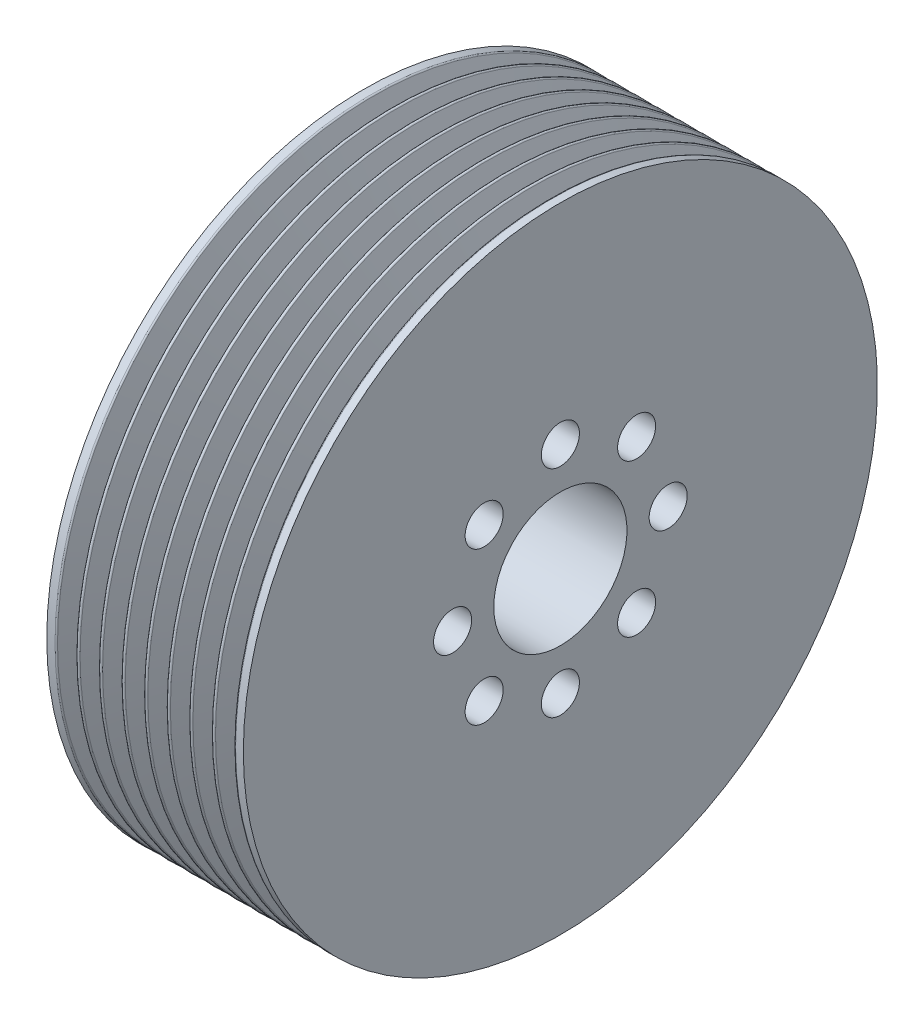
ISO-10303-21;
HEADER;
FILE_DESCRIPTION(('STEP AP214'),'2;1');
FILE_NAME('part.step','',(''),(''),'','','');
FILE_SCHEMA(('AUTOMOTIVE_DESIGN { 1 0 10303 214 1 1 1 1 }'));
ENDSEC;
DATA;
#1=APPLICATION_CONTEXT('core data for automotive mechanical design processes');
#2=APPLICATION_PROTOCOL_DEFINITION('international standard','automotive_design',2000,#1);
#3=PRODUCT_CONTEXT('',#1,'mechanical');
#4=PRODUCT('Part','Part','',(#3));
#5=PRODUCT_RELATED_PRODUCT_CATEGORY('part','',(#4));
#6=PRODUCT_DEFINITION_FORMATION('','',#4);
#7=PRODUCT_DEFINITION_CONTEXT('part definition',#1,'design');
#8=PRODUCT_DEFINITION('design','',#6,#7);
#9=PRODUCT_DEFINITION_SHAPE('','',#8);
#10=(LENGTH_UNIT() NAMED_UNIT(*) SI_UNIT(.MILLI.,.METRE.));
#11=(NAMED_UNIT(*) PLANE_ANGLE_UNIT() SI_UNIT($,.RADIAN.));
#12=(NAMED_UNIT(*) SI_UNIT($,.STERADIAN.) SOLID_ANGLE_UNIT());
#13=UNCERTAINTY_MEASURE_WITH_UNIT(LENGTH_MEASURE(1.E-05),#10,'distance_accuracy_value','');
#14=(GEOMETRIC_REPRESENTATION_CONTEXT(3) GLOBAL_UNCERTAINTY_ASSIGNED_CONTEXT((#13)) GLOBAL_UNIT_ASSIGNED_CONTEXT((#10,
#11,#12)) REPRESENTATION_CONTEXT('',''));
#15=CARTESIAN_POINT('',(0.,0.,0.));
#16=DIRECTION('',(0.,0.,1.));
#17=DIRECTION('',(1.,0.,0.));
#18=AXIS2_PLACEMENT_3D('',#15,#16,#17);
#19=CARTESIAN_POINT('',(0.,0.,0.));
#20=DIRECTION('',(-1.,0.,0.));
#21=DIRECTION('',(0.,0.,1.));
#22=AXIS2_PLACEMENT_3D('',#19,#20,#21);
#23=CYLINDRICAL_SURFACE('',#22,50.);
#24=CARTESIAN_POINT('',(18.,0.,0.));
#25=DIRECTION('',(-1.,0.,0.));
#26=DIRECTION('',(0.,0.,1.));
#27=AXIS2_PLACEMENT_3D('',#24,#25,#26);
#28=CIRCLE('',#27,50.);
#29=CARTESIAN_POINT('',(18.,0.,50.));
#30=VERTEX_POINT('',#29);
#31=EDGE_CURVE('E59',#30,#30,#28,.T.);
#32=ORIENTED_EDGE('',*,*,#31,.F.);
#33=EDGE_LOOP('',(#32));
#34=FACE_BOUND('',#33,.T.);
#35=CARTESIAN_POINT('',(19.3,0.,0.));
#36=DIRECTION('',(-1.,0.,0.));
#37=DIRECTION('',(0.,0.,1.));
#38=AXIS2_PLACEMENT_3D('',#35,#36,#37);
#39=CIRCLE('',#38,50.);
#40=CARTESIAN_POINT('',(19.3,0.,50.));
#41=VERTEX_POINT('',#40);
#42=EDGE_CURVE('E210',#41,#41,#39,.T.);
#43=ORIENTED_EDGE('',*,*,#42,.T.);
#44=EDGE_LOOP('',(#43));
#45=FACE_BOUND('',#44,.T.);
#46=ADVANCED_FACE('F45',(#34,#45),#23,.T.);
#47=CARTESIAN_POINT('',(31.5,10.5,0.));
#48=DIRECTION('',(1.,0.,0.));
#49=DIRECTION('',(0.,0.,-1.));
#50=AXIS2_PLACEMENT_3D('',#47,#48,#49);
#51=PLANE('',#50);
#52=CARTESIAN_POINT('',(31.5,12.0208152801713,12.0208152801713));
#53=DIRECTION('',(1.,0.,0.));
#54=DIRECTION('',(0.,0.,-1.));
#55=AXIS2_PLACEMENT_3D('',#52,#53,#54);
#56=CIRCLE('',#55,3.);
#57=CARTESIAN_POINT('',(31.5,12.0208152801713,9.02081528017131));
#58=VERTEX_POINT('',#57);
#59=EDGE_CURVE('E270',#58,#58,#56,.F.);
#60=ORIENTED_EDGE('',*,*,#59,.F.);
#61=EDGE_LOOP('',(#60));
#62=FACE_BOUND('',#61,.T.);
#63=CARTESIAN_POINT('',(31.5,-12.0208152801713,12.0208152801713));
#64=DIRECTION('',(1.,0.,0.));
#65=DIRECTION('',(0.,0.,-1.));
#66=AXIS2_PLACEMENT_3D('',#63,#64,#65);
#67=CIRCLE('',#66,3.);
#68=CARTESIAN_POINT('',(31.5,-12.0208152801713,9.02081528017131));
#69=VERTEX_POINT('',#68);
#70=EDGE_CURVE('E262',#69,#69,#67,.F.);
#71=ORIENTED_EDGE('',*,*,#70,.F.);
#72=EDGE_LOOP('',(#71));
#73=FACE_BOUND('',#72,.T.);
#74=CARTESIAN_POINT('',(31.5,-17.,0.));
#75=DIRECTION('',(1.,0.,0.));
#76=DIRECTION('',(0.,0.,-1.));
#77=AXIS2_PLACEMENT_3D('',#74,#75,#76);
#78=CIRCLE('',#77,3.);
#79=CARTESIAN_POINT('',(31.5,-17.,-3.));
#80=VERTEX_POINT('',#79);
#81=EDGE_CURVE('E254',#80,#80,#78,.F.);
#82=ORIENTED_EDGE('',*,*,#81,.F.);
#83=EDGE_LOOP('',(#82));
#84=FACE_BOUND('',#83,.T.);
#85=CARTESIAN_POINT('',(31.5,-12.0208152801713,-12.0208152801713));
#86=DIRECTION('',(1.,0.,0.));
#87=DIRECTION('',(0.,0.,-1.));
#88=AXIS2_PLACEMENT_3D('',#85,#86,#87);
#89=CIRCLE('',#88,3.);
#90=CARTESIAN_POINT('',(31.5,-12.0208152801713,-15.0208152801713));
#91=VERTEX_POINT('',#90);
#92=EDGE_CURVE('E246',#91,#91,#89,.F.);
#93=ORIENTED_EDGE('',*,*,#92,.F.);
#94=EDGE_LOOP('',(#93));
#95=FACE_BOUND('',#94,.T.);
#96=CARTESIAN_POINT('',(31.5,0.,-17.));
#97=DIRECTION('',(1.,0.,0.));
#98=DIRECTION('',(0.,0.,-1.));
#99=AXIS2_PLACEMENT_3D('',#96,#97,#98);
#100=CIRCLE('',#99,2.99999999999999);
#101=CARTESIAN_POINT('',(31.5,0.,-20.));
#102=VERTEX_POINT('',#101);
#103=EDGE_CURVE('E238',#102,#102,#100,.F.);
#104=ORIENTED_EDGE('',*,*,#103,.F.);
#105=EDGE_LOOP('',(#104));
#106=FACE_BOUND('',#105,.T.);
#107=CARTESIAN_POINT('',(31.5,12.0208152801713,-12.0208152801713));
#108=DIRECTION('',(1.,0.,0.));
#109=DIRECTION('',(0.,0.,-1.));
#110=AXIS2_PLACEMENT_3D('',#107,#108,#109);
#111=CIRCLE('',#110,3.);
#112=CARTESIAN_POINT('',(31.5,12.0208152801713,-15.0208152801713));
#113=VERTEX_POINT('',#112);
#114=EDGE_CURVE('E230',#113,#113,#111,.F.);
#115=ORIENTED_EDGE('',*,*,#114,.F.);
#116=EDGE_LOOP('',(#115));
#117=FACE_BOUND('',#116,.T.);
#118=CARTESIAN_POINT('',(31.5,0.,17.));
#119=DIRECTION('',(1.,0.,0.));
#120=DIRECTION('',(0.,0.,-1.));
#121=AXIS2_PLACEMENT_3D('',#118,#119,#120);
#122=CIRCLE('',#121,3.);
#123=CARTESIAN_POINT('',(31.5,0.,14.));
#124=VERTEX_POINT('',#123);
#125=EDGE_CURVE('E222',#124,#124,#122,.F.);
#126=ORIENTED_EDGE('',*,*,#125,.F.);
#127=EDGE_LOOP('',(#126));
#128=FACE_BOUND('',#127,.T.);
#129=CARTESIAN_POINT('',(31.5,17.,0.));
#130=DIRECTION('',(1.,0.,0.));
#131=DIRECTION('',(0.,0.,-1.));
#132=AXIS2_PLACEMENT_3D('',#129,#130,#131);
#133=CIRCLE('',#132,3.);
#134=CARTESIAN_POINT('',(31.5,17.,-3.));
#135=VERTEX_POINT('',#134);
#136=EDGE_CURVE('E214',#135,#135,#133,.F.);
#137=ORIENTED_EDGE('',*,*,#136,.F.);
#138=EDGE_LOOP('',(#137));
#139=FACE_BOUND('',#138,.T.);
#140=CARTESIAN_POINT('',(31.5,0.,0.));
#141=DIRECTION('',(-1.,0.,0.));
#142=DIRECTION('',(0.,0.,1.));
#143=AXIS2_PLACEMENT_3D('',#140,#141,#142);
#144=CIRCLE('',#143,10.5);
#145=CARTESIAN_POINT('',(31.5,0.,10.5));
#146=VERTEX_POINT('',#145);
#147=EDGE_CURVE('E74',#146,#146,#144,.T.);
#148=ORIENTED_EDGE('',*,*,#147,.F.);
#149=EDGE_LOOP('',(#148));
#150=FACE_BOUND('',#149,.T.);
#151=CARTESIAN_POINT('',(31.5,0.,0.));
#152=DIRECTION('',(-1.,0.,0.));
#153=DIRECTION('',(0.,0.,1.));
#154=AXIS2_PLACEMENT_3D('',#151,#152,#153);
#155=CIRCLE('',#154,21.5);
#156=CARTESIAN_POINT('',(31.5,0.,21.5));
#157=VERTEX_POINT('',#156);
#158=EDGE_CURVE('E10',#157,#157,#155,.T.);
#159=ORIENTED_EDGE('',*,*,#158,.T.);
#160=EDGE_LOOP('',(#159));
#161=FACE_BOUND('',#160,.T.);
#162=ADVANCED_FACE('F48',(#62,#73,#84,#95,#106,#117,#128,#139,#150,#161),#51,.F.);
#163=CARTESIAN_POINT('',(0.,0.,0.));
#164=DIRECTION('',(-1.,0.,0.));
#165=DIRECTION('',(0.,0.,1.));
#166=AXIS2_PLACEMENT_3D('',#163,#164,#165);
#167=CYLINDRICAL_SURFACE('',#166,21.5);
#168=ORIENTED_EDGE('',*,*,#158,.F.);
#169=EDGE_LOOP('',(#168));
#170=FACE_BOUND('',#169,.T.);
#171=CARTESIAN_POINT('',(18.,0.,0.));
#172=DIRECTION('',(-1.,0.,0.));
#173=DIRECTION('',(0.,0.,1.));
#174=AXIS2_PLACEMENT_3D('',#171,#172,#173);
#175=CIRCLE('',#174,21.5);
#176=CARTESIAN_POINT('',(18.,0.,21.5));
#177=VERTEX_POINT('',#176);
#178=EDGE_CURVE('E54',#177,#177,#175,.T.);
#179=ORIENTED_EDGE('',*,*,#178,.T.);
#180=EDGE_LOOP('',(#179));
#181=FACE_BOUND('',#180,.T.);
#182=ADVANCED_FACE('F312',(#170,#181),#167,.F.);
#183=CARTESIAN_POINT('',(18.,50.,0.));
#184=DIRECTION('',(1.,0.,0.));
#185=DIRECTION('',(0.,0.,-1.));
#186=AXIS2_PLACEMENT_3D('',#183,#184,#185);
#187=PLANE('',#186);
#188=ORIENTED_EDGE('',*,*,#178,.F.);
#189=EDGE_LOOP('',(#188));
#190=FACE_BOUND('',#189,.T.);
#191=ORIENTED_EDGE('',*,*,#31,.T.);
#192=EDGE_LOOP('',(#191));
#193=FACE_BOUND('',#192,.T.);
#194=ADVANCED_FACE('F318',(#190,#193),#187,.F.);
#195=CARTESIAN_POINT('',(47.78,0.,0.));
#196=DIRECTION('',(-1.,0.,0.));
#197=DIRECTION('',(0.,0.,1.));
#198=AXIS2_PLACEMENT_3D('',#195,#196,#197);
#199=CIRCLE('',#198,50.);
#200=CARTESIAN_POINT('',(47.78,0.,50.));
#201=VERTEX_POINT('',#200);
#202=EDGE_CURVE('E94',#201,#201,#199,.T.);
#203=ORIENTED_EDGE('',*,*,#202,.F.);
#204=EDGE_LOOP('',(#203));
#205=FACE_BOUND('',#204,.T.);
#206=CARTESIAN_POINT('',(49.,0.,0.));
#207=DIRECTION('',(-1.,0.,0.));
#208=DIRECTION('',(0.,0.,1.));
#209=AXIS2_PLACEMENT_3D('',#206,#207,#208);
#210=CIRCLE('',#209,50.);
#211=CARTESIAN_POINT('',(49.,0.,50.));
#212=VERTEX_POINT('',#211);
#213=EDGE_CURVE('E64',#212,#212,#210,.T.);
#214=ORIENTED_EDGE('',*,*,#213,.T.);
#215=EDGE_LOOP('',(#214));
#216=FACE_BOUND('',#215,.T.);
#217=ADVANCED_FACE('F285',(#205,#216),#23,.T.);
#218=CARTESIAN_POINT('',(49.,10.5,0.));
#219=DIRECTION('',(-1.,0.,0.));
#220=DIRECTION('',(0.,0.,1.));
#221=AXIS2_PLACEMENT_3D('',#218,#219,#220);
#222=PLANE('',#221);
#223=CARTESIAN_POINT('',(49.,12.0208152801713,12.0208152801713));
#224=DIRECTION('',(1.,0.,0.));
#225=DIRECTION('',(0.,0.,-1.));
#226=AXIS2_PLACEMENT_3D('',#223,#224,#225);
#227=CIRCLE('',#226,3.);
#228=CARTESIAN_POINT('',(49.,12.0208152801713,9.02081528017131));
#229=VERTEX_POINT('',#228);
#230=EDGE_CURVE('E274',#229,#229,#227,.T.);
#231=ORIENTED_EDGE('',*,*,#230,.F.);
#232=EDGE_LOOP('',(#231));
#233=FACE_BOUND('',#232,.T.);
#234=CARTESIAN_POINT('',(49.,-12.0208152801713,12.0208152801713));
#235=DIRECTION('',(1.,0.,0.));
#236=DIRECTION('',(0.,0.,-1.));
#237=AXIS2_PLACEMENT_3D('',#234,#235,#236);
#238=CIRCLE('',#237,3.);
#239=CARTESIAN_POINT('',(49.,-12.0208152801713,9.02081528017131));
#240=VERTEX_POINT('',#239);
#241=EDGE_CURVE('E266',#240,#240,#238,.T.);
#242=ORIENTED_EDGE('',*,*,#241,.F.);
#243=EDGE_LOOP('',(#242));
#244=FACE_BOUND('',#243,.T.);
#245=CARTESIAN_POINT('',(49.,-17.,0.));
#246=DIRECTION('',(1.,0.,0.));
#247=DIRECTION('',(0.,0.,-1.));
#248=AXIS2_PLACEMENT_3D('',#245,#246,#247);
#249=CIRCLE('',#248,3.);
#250=CARTESIAN_POINT('',(49.,-17.,-3.));
#251=VERTEX_POINT('',#250);
#252=EDGE_CURVE('E258',#251,#251,#249,.T.);
#253=ORIENTED_EDGE('',*,*,#252,.F.);
#254=EDGE_LOOP('',(#253));
#255=FACE_BOUND('',#254,.T.);
#256=CARTESIAN_POINT('',(49.,-12.0208152801713,-12.0208152801713));
#257=DIRECTION('',(1.,0.,0.));
#258=DIRECTION('',(0.,0.,-1.));
#259=AXIS2_PLACEMENT_3D('',#256,#257,#258);
#260=CIRCLE('',#259,3.);
#261=CARTESIAN_POINT('',(49.,-12.0208152801713,-15.0208152801713));
#262=VERTEX_POINT('',#261);
#263=EDGE_CURVE('E250',#262,#262,#260,.T.);
#264=ORIENTED_EDGE('',*,*,#263,.F.);
#265=EDGE_LOOP('',(#264));
#266=FACE_BOUND('',#265,.T.);
#267=CARTESIAN_POINT('',(49.,0.,-17.));
#268=DIRECTION('',(1.,0.,0.));
#269=DIRECTION('',(0.,0.,-1.));
#270=AXIS2_PLACEMENT_3D('',#267,#268,#269);
#271=CIRCLE('',#270,2.99999999999999);
#272=CARTESIAN_POINT('',(49.,0.,-20.));
#273=VERTEX_POINT('',#272);
#274=EDGE_CURVE('E242',#273,#273,#271,.T.);
#275=ORIENTED_EDGE('',*,*,#274,.F.);
#276=EDGE_LOOP('',(#275));
#277=FACE_BOUND('',#276,.T.);
#278=CARTESIAN_POINT('',(49.,12.0208152801713,-12.0208152801713));
#279=DIRECTION('',(1.,0.,0.));
#280=DIRECTION('',(0.,0.,-1.));
#281=AXIS2_PLACEMENT_3D('',#278,#279,#280);
#282=CIRCLE('',#281,3.);
#283=CARTESIAN_POINT('',(49.,12.0208152801713,-15.0208152801713));
#284=VERTEX_POINT('',#283);
#285=EDGE_CURVE('E234',#284,#284,#282,.T.);
#286=ORIENTED_EDGE('',*,*,#285,.F.);
#287=EDGE_LOOP('',(#286));
#288=FACE_BOUND('',#287,.T.);
#289=CARTESIAN_POINT('',(49.,0.,17.));
#290=DIRECTION('',(1.,0.,0.));
#291=DIRECTION('',(0.,0.,-1.));
#292=AXIS2_PLACEMENT_3D('',#289,#290,#291);
#293=CIRCLE('',#292,3.);
#294=CARTESIAN_POINT('',(49.,0.,14.));
#295=VERTEX_POINT('',#294);
#296=EDGE_CURVE('E226',#295,#295,#293,.T.);
#297=ORIENTED_EDGE('',*,*,#296,.F.);
#298=EDGE_LOOP('',(#297));
#299=FACE_BOUND('',#298,.T.);
#300=CARTESIAN_POINT('',(49.,17.,0.));
#301=DIRECTION('',(1.,0.,0.));
#302=DIRECTION('',(0.,0.,-1.));
#303=AXIS2_PLACEMENT_3D('',#300,#301,#302);
#304=CIRCLE('',#303,3.);
#305=CARTESIAN_POINT('',(49.,17.,-3.));
#306=VERTEX_POINT('',#305);
#307=EDGE_CURVE('E218',#306,#306,#304,.T.);
#308=ORIENTED_EDGE('',*,*,#307,.F.);
#309=EDGE_LOOP('',(#308));
#310=FACE_BOUND('',#309,.T.);
#311=ORIENTED_EDGE('',*,*,#213,.F.);
#312=EDGE_LOOP('',(#311));
#313=FACE_BOUND('',#312,.T.);
#314=CARTESIAN_POINT('',(49.,0.,0.));
#315=DIRECTION('',(-1.,0.,0.));
#316=DIRECTION('',(0.,0.,1.));
#317=AXIS2_PLACEMENT_3D('',#314,#315,#316);
#318=CIRCLE('',#317,10.5);
#319=CARTESIAN_POINT('',(49.,0.,10.5));
#320=VERTEX_POINT('',#319);
#321=EDGE_CURVE('E70',#320,#320,#318,.T.);
#322=ORIENTED_EDGE('',*,*,#321,.T.);
#323=EDGE_LOOP('',(#322));
#324=FACE_BOUND('',#323,.T.);
#325=ADVANCED_FACE('F281',(#233,#244,#255,#266,#277,#288,#299,#310,#313,#324),#222,.F.);
#326=CARTESIAN_POINT('',(0.,0.,0.));
#327=DIRECTION('',(-1.,0.,0.));
#328=DIRECTION('',(0.,0.,1.));
#329=AXIS2_PLACEMENT_3D('',#326,#327,#328);
#330=CYLINDRICAL_SURFACE('',#329,10.5);
#331=ORIENTED_EDGE('',*,*,#321,.F.);
#332=EDGE_LOOP('',(#331));
#333=FACE_BOUND('',#332,.T.);
#334=ORIENTED_EDGE('',*,*,#147,.T.);
#335=EDGE_LOOP('',(#334));
#336=FACE_BOUND('',#335,.T.);
#337=ADVANCED_FACE('F284',(#333,#336),#330,.F.);
#338=CARTESIAN_POINT('',(47.78,0.,0.));
#339=DIRECTION('',(-1.,0.,0.));
#340=DIRECTION('',(0.,0.,1.));
#341=AXIS2_PLACEMENT_3D('',#338,#339,#340);
#342=TOROIDAL_SURFACE('',#341,49.75,0.249999999999999);
#343=ORIENTED_EDGE('',*,*,#202,.T.);
#344=EDGE_LOOP('',(#343));
#345=FACE_BOUND('',#344,.T.);
#346=CARTESIAN_POINT('',(47.5458319526879,0.,0.));
#347=DIRECTION('',(-1.,0.,0.));
#348=DIRECTION('',(0.,0.,1.));
#349=AXIS2_PLACEMENT_3D('',#346,#347,#348);
#350=CIRCLE('',#349,49.8375518453149);
#351=CARTESIAN_POINT('',(47.5458319526879,0.,49.8375518453149));
#352=VERTEX_POINT('',#351);
#353=EDGE_CURVE('E78',#352,#352,#350,.T.);
#354=ORIENTED_EDGE('',*,*,#353,.F.);
#355=EDGE_LOOP('',(#354));
#356=FACE_BOUND('',#355,.T.);
#357=ADVANCED_FACE('F307',(#345,#356),#342,.T.);
#358=CARTESIAN_POINT('',(46.2810016567745,0.,0.));
#359=DIRECTION('',(1.,0.,0.));
#360=DIRECTION('',(0.,0.,-1.));
#361=AXIS2_PLACEMENT_3D('',#358,#359,#360);
#362=CONICAL_SURFACE('',#361,46.4546095496951,1.21300383013606);
#363=ORIENTED_EDGE('',*,*,#353,.T.);
#364=EDGE_LOOP('',(#363));
#365=FACE_BOUND('',#364,.T.);
#366=CARTESIAN_POINT('',(46.2810016567745,0.,0.));
#367=DIRECTION('',(-1.,0.,0.));
#368=DIRECTION('',(0.,0.,1.));
#369=AXIS2_PLACEMENT_3D('',#366,#367,#368);
#370=CIRCLE('',#369,46.4546095496951);
#371=CARTESIAN_POINT('',(46.2810016567745,0.,46.4546095496951));
#372=VERTEX_POINT('',#371);
#373=EDGE_CURVE('E82',#372,#372,#370,.T.);
#374=ORIENTED_EDGE('',*,*,#373,.F.);
#375=EDGE_LOOP('',(#374));
#376=FACE_BOUND('',#375,.T.);
#377=ADVANCED_FACE('F508',(#365,#376),#362,.T.);
#378=CARTESIAN_POINT('',(46.,0.,0.));
#379=DIRECTION('',(-1.,0.,0.));
#380=DIRECTION('',(0.,0.,1.));
#381=AXIS2_PLACEMENT_3D('',#378,#379,#380);
#382=TOROIDAL_SURFACE('',#381,46.5596717640729,0.3);
#383=ORIENTED_EDGE('',*,*,#373,.T.);
#384=EDGE_LOOP('',(#383));
#385=FACE_BOUND('',#384,.T.);
#386=CARTESIAN_POINT('',(45.7189983432255,0.,0.));
#387=DIRECTION('',(-1.,0.,0.));
#388=DIRECTION('',(0.,0.,1.));
#389=AXIS2_PLACEMENT_3D('',#386,#387,#388);
#390=CIRCLE('',#389,46.4546095496951);
#391=CARTESIAN_POINT('',(45.7189983432255,0.,46.4546095496951));
#392=VERTEX_POINT('',#391);
#393=EDGE_CURVE('E86',#392,#392,#390,.T.);
#394=ORIENTED_EDGE('',*,*,#393,.F.);
#395=EDGE_LOOP('',(#394));
#396=FACE_BOUND('',#395,.T.);
#397=ADVANCED_FACE('F503',(#385,#396),#382,.F.);
#398=CARTESIAN_POINT('',(44.4541680473121,0.,0.));
#399=DIRECTION('',(-1.,0.,0.));
#400=DIRECTION('',(0.,0.,1.));
#401=AXIS2_PLACEMENT_3D('',#398,#399,#400);
#402=CONICAL_SURFACE('',#401,49.8375518453149,1.21300383013606);
#403=ORIENTED_EDGE('',*,*,#393,.T.);
#404=EDGE_LOOP('',(#403));
#405=FACE_BOUND('',#404,.T.);
#406=CARTESIAN_POINT('',(44.4541680473121,0.,0.));
#407=DIRECTION('',(-1.,0.,0.));
#408=DIRECTION('',(0.,0.,1.));
#409=AXIS2_PLACEMENT_3D('',#406,#407,#408);
#410=CIRCLE('',#409,49.8375518453149);
#411=CARTESIAN_POINT('',(44.4541680473121,0.,49.8375518453149));
#412=VERTEX_POINT('',#411);
#413=EDGE_CURVE('E90',#412,#412,#410,.T.);
#414=ORIENTED_EDGE('',*,*,#413,.F.);
#415=EDGE_LOOP('',(#414));
#416=FACE_BOUND('',#415,.T.);
#417=ADVANCED_FACE('F498',(#405,#416),#402,.T.);
#418=CARTESIAN_POINT('',(44.22,0.,0.));
#419=DIRECTION('',(-1.,0.,0.));
#420=DIRECTION('',(0.,0.,1.));
#421=AXIS2_PLACEMENT_3D('',#418,#419,#420);
#422=TOROIDAL_SURFACE('',#421,49.75,0.250000000000003);
#423=ORIENTED_EDGE('',*,*,#413,.T.);
#424=EDGE_LOOP('',(#423));
#425=FACE_BOUND('',#424,.T.);
#426=CARTESIAN_POINT('',(43.9858319526879,0.,0.));
#427=DIRECTION('',(-1.,0.,0.));
#428=DIRECTION('',(0.,0.,1.));
#429=AXIS2_PLACEMENT_3D('',#426,#427,#428);
#430=CIRCLE('',#429,49.8375518453149);
#431=CARTESIAN_POINT('',(43.9858319526879,0.,49.8375518453149));
#432=VERTEX_POINT('',#431);
#433=EDGE_CURVE('E98',#432,#432,#430,.T.);
#434=ORIENTED_EDGE('',*,*,#433,.F.);
#435=EDGE_LOOP('',(#434));
#436=FACE_BOUND('',#435,.T.);
#437=ADVANCED_FACE('F493',(#425,#436),#422,.T.);
#438=CARTESIAN_POINT('',(42.7210016567745,0.,0.));
#439=DIRECTION('',(1.,0.,0.));
#440=DIRECTION('',(0.,0.,-1.));
#441=AXIS2_PLACEMENT_3D('',#438,#439,#440);
#442=CONICAL_SURFACE('',#441,46.4546095496951,1.21300383013606);
#443=ORIENTED_EDGE('',*,*,#433,.T.);
#444=EDGE_LOOP('',(#443));
#445=FACE_BOUND('',#444,.T.);
#446=CARTESIAN_POINT('',(42.7210016567745,0.,0.));
#447=DIRECTION('',(-1.,0.,0.));
#448=DIRECTION('',(0.,0.,1.));
#449=AXIS2_PLACEMENT_3D('',#446,#447,#448);
#450=CIRCLE('',#449,46.4546095496951);
#451=CARTESIAN_POINT('',(42.7210016567745,0.,46.4546095496951));
#452=VERTEX_POINT('',#451);
#453=EDGE_CURVE('E102',#452,#452,#450,.T.);
#454=ORIENTED_EDGE('',*,*,#453,.F.);
#455=EDGE_LOOP('',(#454));
#456=FACE_BOUND('',#455,.T.);
#457=ADVANCED_FACE('F488',(#445,#456),#442,.T.);
#458=CARTESIAN_POINT('',(42.44,0.,0.));
#459=DIRECTION('',(-1.,0.,0.));
#460=DIRECTION('',(0.,0.,1.));
#461=AXIS2_PLACEMENT_3D('',#458,#459,#460);
#462=TOROIDAL_SURFACE('',#461,46.5596717640729,0.3);
#463=ORIENTED_EDGE('',*,*,#453,.T.);
#464=EDGE_LOOP('',(#463));
#465=FACE_BOUND('',#464,.T.);
#466=CARTESIAN_POINT('',(42.1589983432255,0.,0.));
#467=DIRECTION('',(-1.,0.,0.));
#468=DIRECTION('',(0.,0.,1.));
#469=AXIS2_PLACEMENT_3D('',#466,#467,#468);
#470=CIRCLE('',#469,46.4546095496951);
#471=CARTESIAN_POINT('',(42.1589983432255,0.,46.4546095496951));
#472=VERTEX_POINT('',#471);
#473=EDGE_CURVE('E106',#472,#472,#470,.T.);
#474=ORIENTED_EDGE('',*,*,#473,.F.);
#475=EDGE_LOOP('',(#474));
#476=FACE_BOUND('',#475,.T.);
#477=ADVANCED_FACE('F483',(#465,#476),#462,.F.);
#478=CARTESIAN_POINT('',(40.8941680473121,0.,0.));
#479=DIRECTION('',(-1.,0.,0.));
#480=DIRECTION('',(0.,0.,1.));
#481=AXIS2_PLACEMENT_3D('',#478,#479,#480);
#482=CONICAL_SURFACE('',#481,49.8375518453149,1.21300383013606);
#483=ORIENTED_EDGE('',*,*,#473,.T.);
#484=EDGE_LOOP('',(#483));
#485=FACE_BOUND('',#484,.T.);
#486=CARTESIAN_POINT('',(40.8941680473121,0.,0.));
#487=DIRECTION('',(-1.,0.,0.));
#488=DIRECTION('',(0.,0.,1.));
#489=AXIS2_PLACEMENT_3D('',#486,#487,#488);
#490=CIRCLE('',#489,49.8375518453149);
#491=CARTESIAN_POINT('',(40.8941680473121,0.,49.8375518453149));
#492=VERTEX_POINT('',#491);
#493=EDGE_CURVE('E110',#492,#492,#490,.T.);
#494=ORIENTED_EDGE('',*,*,#493,.F.);
#495=EDGE_LOOP('',(#494));
#496=FACE_BOUND('',#495,.T.);
#497=ADVANCED_FACE('F478',(#485,#496),#482,.T.);
#498=CARTESIAN_POINT('',(40.66,0.,0.));
#499=DIRECTION('',(-1.,0.,0.));
#500=DIRECTION('',(0.,0.,1.));
#501=AXIS2_PLACEMENT_3D('',#498,#499,#500);
#502=TOROIDAL_SURFACE('',#501,49.75,0.250000000000003);
#503=ORIENTED_EDGE('',*,*,#493,.T.);
#504=EDGE_LOOP('',(#503));
#505=FACE_BOUND('',#504,.T.);
#506=CARTESIAN_POINT('',(40.4258319526879,0.,0.));
#507=DIRECTION('',(-1.,0.,0.));
#508=DIRECTION('',(0.,0.,1.));
#509=AXIS2_PLACEMENT_3D('',#506,#507,#508);
#510=CIRCLE('',#509,49.8375518453149);
#511=CARTESIAN_POINT('',(40.4258319526879,0.,49.8375518453149));
#512=VERTEX_POINT('',#511);
#513=EDGE_CURVE('E114',#512,#512,#510,.T.);
#514=ORIENTED_EDGE('',*,*,#513,.F.);
#515=EDGE_LOOP('',(#514));
#516=FACE_BOUND('',#515,.T.);
#517=ADVANCED_FACE('F473',(#505,#516),#502,.T.);
#518=CARTESIAN_POINT('',(39.1610016567745,0.,0.));
#519=DIRECTION('',(1.,0.,0.));
#520=DIRECTION('',(0.,0.,-1.));
#521=AXIS2_PLACEMENT_3D('',#518,#519,#520);
#522=CONICAL_SURFACE('',#521,46.4546095496951,1.21300383013606);
#523=ORIENTED_EDGE('',*,*,#513,.T.);
#524=EDGE_LOOP('',(#523));
#525=FACE_BOUND('',#524,.T.);
#526=CARTESIAN_POINT('',(39.1610016567745,0.,0.));
#527=DIRECTION('',(-1.,0.,0.));
#528=DIRECTION('',(0.,0.,1.));
#529=AXIS2_PLACEMENT_3D('',#526,#527,#528);
#530=CIRCLE('',#529,46.4546095496951);
#531=CARTESIAN_POINT('',(39.1610016567745,0.,46.4546095496951));
#532=VERTEX_POINT('',#531);
#533=EDGE_CURVE('E118',#532,#532,#530,.T.);
#534=ORIENTED_EDGE('',*,*,#533,.F.);
#535=EDGE_LOOP('',(#534));
#536=FACE_BOUND('',#535,.T.);
#537=ADVANCED_FACE('F468',(#525,#536),#522,.T.);
#538=CARTESIAN_POINT('',(38.88,0.,0.));
#539=DIRECTION('',(-1.,0.,0.));
#540=DIRECTION('',(0.,0.,1.));
#541=AXIS2_PLACEMENT_3D('',#538,#539,#540);
#542=TOROIDAL_SURFACE('',#541,46.5596717640729,0.3);
#543=ORIENTED_EDGE('',*,*,#533,.T.);
#544=EDGE_LOOP('',(#543));
#545=FACE_BOUND('',#544,.T.);
#546=CARTESIAN_POINT('',(38.5989983432255,0.,0.));
#547=DIRECTION('',(-1.,0.,0.));
#548=DIRECTION('',(0.,0.,1.));
#549=AXIS2_PLACEMENT_3D('',#546,#547,#548);
#550=CIRCLE('',#549,46.4546095496951);
#551=CARTESIAN_POINT('',(38.5989983432255,0.,46.4546095496951));
#552=VERTEX_POINT('',#551);
#553=EDGE_CURVE('E122',#552,#552,#550,.T.);
#554=ORIENTED_EDGE('',*,*,#553,.F.);
#555=EDGE_LOOP('',(#554));
#556=FACE_BOUND('',#555,.T.);
#557=ADVANCED_FACE('F463',(#545,#556),#542,.F.);
#558=CARTESIAN_POINT('',(37.3341680473121,0.,0.));
#559=DIRECTION('',(-1.,0.,0.));
#560=DIRECTION('',(0.,0.,1.));
#561=AXIS2_PLACEMENT_3D('',#558,#559,#560);
#562=CONICAL_SURFACE('',#561,49.8375518453149,1.21300383013606);
#563=ORIENTED_EDGE('',*,*,#553,.T.);
#564=EDGE_LOOP('',(#563));
#565=FACE_BOUND('',#564,.T.);
#566=CARTESIAN_POINT('',(37.3341680473121,0.,0.));
#567=DIRECTION('',(-1.,0.,0.));
#568=DIRECTION('',(0.,0.,1.));
#569=AXIS2_PLACEMENT_3D('',#566,#567,#568);
#570=CIRCLE('',#569,49.8375518453149);
#571=CARTESIAN_POINT('',(37.3341680473121,0.,49.8375518453149));
#572=VERTEX_POINT('',#571);
#573=EDGE_CURVE('E126',#572,#572,#570,.T.);
#574=ORIENTED_EDGE('',*,*,#573,.F.);
#575=EDGE_LOOP('',(#574));
#576=FACE_BOUND('',#575,.T.);
#577=ADVANCED_FACE('F458',(#565,#576),#562,.T.);
#578=CARTESIAN_POINT('',(37.1,0.,0.));
#579=DIRECTION('',(-1.,0.,0.));
#580=DIRECTION('',(0.,0.,1.));
#581=AXIS2_PLACEMENT_3D('',#578,#579,#580);
#582=TOROIDAL_SURFACE('',#581,49.75,0.250000000000003);
#583=ORIENTED_EDGE('',*,*,#573,.T.);
#584=EDGE_LOOP('',(#583));
#585=FACE_BOUND('',#584,.T.);
#586=CARTESIAN_POINT('',(36.8658319526879,0.,0.));
#587=DIRECTION('',(-1.,0.,0.));
#588=DIRECTION('',(0.,0.,1.));
#589=AXIS2_PLACEMENT_3D('',#586,#587,#588);
#590=CIRCLE('',#589,49.8375518453149);
#591=CARTESIAN_POINT('',(36.8658319526879,0.,49.8375518453149));
#592=VERTEX_POINT('',#591);
#593=EDGE_CURVE('E130',#592,#592,#590,.T.);
#594=ORIENTED_EDGE('',*,*,#593,.F.);
#595=EDGE_LOOP('',(#594));
#596=FACE_BOUND('',#595,.T.);
#597=ADVANCED_FACE('F453',(#585,#596),#582,.T.);
#598=CARTESIAN_POINT('',(35.6010016567745,0.,0.));
#599=DIRECTION('',(1.,0.,0.));
#600=DIRECTION('',(0.,0.,-1.));
#601=AXIS2_PLACEMENT_3D('',#598,#599,#600);
#602=CONICAL_SURFACE('',#601,46.4546095496951,1.21300383013606);
#603=ORIENTED_EDGE('',*,*,#593,.T.);
#604=EDGE_LOOP('',(#603));
#605=FACE_BOUND('',#604,.T.);
#606=CARTESIAN_POINT('',(35.6010016567745,0.,0.));
#607=DIRECTION('',(-1.,0.,0.));
#608=DIRECTION('',(0.,0.,1.));
#609=AXIS2_PLACEMENT_3D('',#606,#607,#608);
#610=CIRCLE('',#609,46.4546095496951);
#611=CARTESIAN_POINT('',(35.6010016567745,0.,46.4546095496951));
#612=VERTEX_POINT('',#611);
#613=EDGE_CURVE('E134',#612,#612,#610,.T.);
#614=ORIENTED_EDGE('',*,*,#613,.F.);
#615=EDGE_LOOP('',(#614));
#616=FACE_BOUND('',#615,.T.);
#617=ADVANCED_FACE('F448',(#605,#616),#602,.T.);
#618=CARTESIAN_POINT('',(35.32,0.,0.));
#619=DIRECTION('',(-1.,0.,0.));
#620=DIRECTION('',(0.,0.,1.));
#621=AXIS2_PLACEMENT_3D('',#618,#619,#620);
#622=TOROIDAL_SURFACE('',#621,46.5596717640729,0.3);
#623=ORIENTED_EDGE('',*,*,#613,.T.);
#624=EDGE_LOOP('',(#623));
#625=FACE_BOUND('',#624,.T.);
#626=CARTESIAN_POINT('',(35.0389983432255,0.,0.));
#627=DIRECTION('',(-1.,0.,0.));
#628=DIRECTION('',(0.,0.,1.));
#629=AXIS2_PLACEMENT_3D('',#626,#627,#628);
#630=CIRCLE('',#629,46.4546095496951);
#631=CARTESIAN_POINT('',(35.0389983432255,0.,46.4546095496951));
#632=VERTEX_POINT('',#631);
#633=EDGE_CURVE('E138',#632,#632,#630,.T.);
#634=ORIENTED_EDGE('',*,*,#633,.F.);
#635=EDGE_LOOP('',(#634));
#636=FACE_BOUND('',#635,.T.);
#637=ADVANCED_FACE('F443',(#625,#636),#622,.F.);
#638=CARTESIAN_POINT('',(33.7741680473121,0.,0.));
#639=DIRECTION('',(-1.,0.,0.));
#640=DIRECTION('',(0.,0.,1.));
#641=AXIS2_PLACEMENT_3D('',#638,#639,#640);
#642=CONICAL_SURFACE('',#641,49.8375518453149,1.21300383013606);
#643=ORIENTED_EDGE('',*,*,#633,.T.);
#644=EDGE_LOOP('',(#643));
#645=FACE_BOUND('',#644,.T.);
#646=CARTESIAN_POINT('',(33.7741680473121,0.,0.));
#647=DIRECTION('',(-1.,0.,0.));
#648=DIRECTION('',(0.,0.,1.));
#649=AXIS2_PLACEMENT_3D('',#646,#647,#648);
#650=CIRCLE('',#649,49.8375518453149);
#651=CARTESIAN_POINT('',(33.7741680473121,0.,49.8375518453149));
#652=VERTEX_POINT('',#651);
#653=EDGE_CURVE('E142',#652,#652,#650,.T.);
#654=ORIENTED_EDGE('',*,*,#653,.F.);
#655=EDGE_LOOP('',(#654));
#656=FACE_BOUND('',#655,.T.);
#657=ADVANCED_FACE('F438',(#645,#656),#642,.T.);
#658=CARTESIAN_POINT('',(33.54,0.,0.));
#659=DIRECTION('',(-1.,0.,0.));
#660=DIRECTION('',(0.,0.,1.));
#661=AXIS2_PLACEMENT_3D('',#658,#659,#660);
#662=TOROIDAL_SURFACE('',#661,49.75,0.250000000000003);
#663=ORIENTED_EDGE('',*,*,#653,.T.);
#664=EDGE_LOOP('',(#663));
#665=FACE_BOUND('',#664,.T.);
#666=CARTESIAN_POINT('',(33.3058319526879,0.,0.));
#667=DIRECTION('',(-1.,0.,0.));
#668=DIRECTION('',(0.,0.,1.));
#669=AXIS2_PLACEMENT_3D('',#666,#667,#668);
#670=CIRCLE('',#669,49.8375518453149);
#671=CARTESIAN_POINT('',(33.3058319526879,0.,49.8375518453149));
#672=VERTEX_POINT('',#671);
#673=EDGE_CURVE('E146',#672,#672,#670,.T.);
#674=ORIENTED_EDGE('',*,*,#673,.F.);
#675=EDGE_LOOP('',(#674));
#676=FACE_BOUND('',#675,.T.);
#677=ADVANCED_FACE('F433',(#665,#676),#662,.T.);
#678=CARTESIAN_POINT('',(32.0410016567745,0.,0.));
#679=DIRECTION('',(1.,0.,0.));
#680=DIRECTION('',(0.,0.,-1.));
#681=AXIS2_PLACEMENT_3D('',#678,#679,#680);
#682=CONICAL_SURFACE('',#681,46.4546095496951,1.21300383013606);
#683=ORIENTED_EDGE('',*,*,#673,.T.);
#684=EDGE_LOOP('',(#683));
#685=FACE_BOUND('',#684,.T.);
#686=CARTESIAN_POINT('',(32.0410016567745,0.,0.));
#687=DIRECTION('',(-1.,0.,0.));
#688=DIRECTION('',(0.,0.,1.));
#689=AXIS2_PLACEMENT_3D('',#686,#687,#688);
#690=CIRCLE('',#689,46.4546095496951);
#691=CARTESIAN_POINT('',(32.0410016567745,0.,46.4546095496951));
#692=VERTEX_POINT('',#691);
#693=EDGE_CURVE('E150',#692,#692,#690,.T.);
#694=ORIENTED_EDGE('',*,*,#693,.F.);
#695=EDGE_LOOP('',(#694));
#696=FACE_BOUND('',#695,.T.);
#697=ADVANCED_FACE('F428',(#685,#696),#682,.T.);
#698=CARTESIAN_POINT('',(31.76,0.,0.));
#699=DIRECTION('',(-1.,0.,0.));
#700=DIRECTION('',(0.,0.,1.));
#701=AXIS2_PLACEMENT_3D('',#698,#699,#700);
#702=TOROIDAL_SURFACE('',#701,46.5596717640729,0.3);
#703=ORIENTED_EDGE('',*,*,#693,.T.);
#704=EDGE_LOOP('',(#703));
#705=FACE_BOUND('',#704,.T.);
#706=CARTESIAN_POINT('',(31.4789983432255,0.,0.));
#707=DIRECTION('',(-1.,0.,0.));
#708=DIRECTION('',(0.,0.,1.));
#709=AXIS2_PLACEMENT_3D('',#706,#707,#708);
#710=CIRCLE('',#709,46.4546095496951);
#711=CARTESIAN_POINT('',(31.4789983432255,0.,46.4546095496951));
#712=VERTEX_POINT('',#711);
#713=EDGE_CURVE('E154',#712,#712,#710,.T.);
#714=ORIENTED_EDGE('',*,*,#713,.F.);
#715=EDGE_LOOP('',(#714));
#716=FACE_BOUND('',#715,.T.);
#717=ADVANCED_FACE('F423',(#705,#716),#702,.F.);
#718=CARTESIAN_POINT('',(30.2141680473121,0.,0.));
#719=DIRECTION('',(-1.,0.,0.));
#720=DIRECTION('',(0.,0.,1.));
#721=AXIS2_PLACEMENT_3D('',#718,#719,#720);
#722=CONICAL_SURFACE('',#721,49.8375518453149,1.21300383013606);
#723=ORIENTED_EDGE('',*,*,#713,.T.);
#724=EDGE_LOOP('',(#723));
#725=FACE_BOUND('',#724,.T.);
#726=CARTESIAN_POINT('',(30.2141680473121,0.,0.));
#727=DIRECTION('',(-1.,0.,0.));
#728=DIRECTION('',(0.,0.,1.));
#729=AXIS2_PLACEMENT_3D('',#726,#727,#728);
#730=CIRCLE('',#729,49.8375518453149);
#731=CARTESIAN_POINT('',(30.2141680473121,0.,49.8375518453149));
#732=VERTEX_POINT('',#731);
#733=EDGE_CURVE('E158',#732,#732,#730,.T.);
#734=ORIENTED_EDGE('',*,*,#733,.F.);
#735=EDGE_LOOP('',(#734));
#736=FACE_BOUND('',#735,.T.);
#737=ADVANCED_FACE('F418',(#725,#736),#722,.T.);
#738=CARTESIAN_POINT('',(29.98,0.,0.));
#739=DIRECTION('',(-1.,0.,0.));
#740=DIRECTION('',(0.,0.,1.));
#741=AXIS2_PLACEMENT_3D('',#738,#739,#740);
#742=TOROIDAL_SURFACE('',#741,49.75,0.250000000000003);
#743=ORIENTED_EDGE('',*,*,#733,.T.);
#744=EDGE_LOOP('',(#743));
#745=FACE_BOUND('',#744,.T.);
#746=CARTESIAN_POINT('',(29.7458319526879,0.,0.));
#747=DIRECTION('',(-1.,0.,0.));
#748=DIRECTION('',(0.,0.,1.));
#749=AXIS2_PLACEMENT_3D('',#746,#747,#748);
#750=CIRCLE('',#749,49.8375518453149);
#751=CARTESIAN_POINT('',(29.7458319526879,0.,49.8375518453149));
#752=VERTEX_POINT('',#751);
#753=EDGE_CURVE('E162',#752,#752,#750,.T.);
#754=ORIENTED_EDGE('',*,*,#753,.F.);
#755=EDGE_LOOP('',(#754));
#756=FACE_BOUND('',#755,.T.);
#757=ADVANCED_FACE('F413',(#745,#756),#742,.T.);
#758=CARTESIAN_POINT('',(28.4810016567745,0.,0.));
#759=DIRECTION('',(1.,0.,0.));
#760=DIRECTION('',(0.,0.,-1.));
#761=AXIS2_PLACEMENT_3D('',#758,#759,#760);
#762=CONICAL_SURFACE('',#761,46.4546095496951,1.21300383013606);
#763=ORIENTED_EDGE('',*,*,#753,.T.);
#764=EDGE_LOOP('',(#763));
#765=FACE_BOUND('',#764,.T.);
#766=CARTESIAN_POINT('',(28.4810016567745,0.,0.));
#767=DIRECTION('',(-1.,0.,0.));
#768=DIRECTION('',(0.,0.,1.));
#769=AXIS2_PLACEMENT_3D('',#766,#767,#768);
#770=CIRCLE('',#769,46.4546095496951);
#771=CARTESIAN_POINT('',(28.4810016567745,0.,46.4546095496951));
#772=VERTEX_POINT('',#771);
#773=EDGE_CURVE('E166',#772,#772,#770,.T.);
#774=ORIENTED_EDGE('',*,*,#773,.F.);
#775=EDGE_LOOP('',(#774));
#776=FACE_BOUND('',#775,.T.);
#777=ADVANCED_FACE('F408',(#765,#776),#762,.T.);
#778=CARTESIAN_POINT('',(28.2,0.,0.));
#779=DIRECTION('',(-1.,0.,0.));
#780=DIRECTION('',(0.,0.,1.));
#781=AXIS2_PLACEMENT_3D('',#778,#779,#780);
#782=TOROIDAL_SURFACE('',#781,46.5596717640729,0.3);
#783=ORIENTED_EDGE('',*,*,#773,.T.);
#784=EDGE_LOOP('',(#783));
#785=FACE_BOUND('',#784,.T.);
#786=CARTESIAN_POINT('',(27.9189983432255,0.,0.));
#787=DIRECTION('',(-1.,0.,0.));
#788=DIRECTION('',(0.,0.,1.));
#789=AXIS2_PLACEMENT_3D('',#786,#787,#788);
#790=CIRCLE('',#789,46.4546095496951);
#791=CARTESIAN_POINT('',(27.9189983432255,0.,46.4546095496951));
#792=VERTEX_POINT('',#791);
#793=EDGE_CURVE('E170',#792,#792,#790,.T.);
#794=ORIENTED_EDGE('',*,*,#793,.F.);
#795=EDGE_LOOP('',(#794));
#796=FACE_BOUND('',#795,.T.);
#797=ADVANCED_FACE('F403',(#785,#796),#782,.F.);
#798=CARTESIAN_POINT('',(26.6541680473121,0.,0.));
#799=DIRECTION('',(-1.,0.,0.));
#800=DIRECTION('',(0.,0.,1.));
#801=AXIS2_PLACEMENT_3D('',#798,#799,#800);
#802=CONICAL_SURFACE('',#801,49.8375518453149,1.21300383013606);
#803=ORIENTED_EDGE('',*,*,#793,.T.);
#804=EDGE_LOOP('',(#803));
#805=FACE_BOUND('',#804,.T.);
#806=CARTESIAN_POINT('',(26.6541680473121,0.,0.));
#807=DIRECTION('',(-1.,0.,0.));
#808=DIRECTION('',(0.,0.,1.));
#809=AXIS2_PLACEMENT_3D('',#806,#807,#808);
#810=CIRCLE('',#809,49.8375518453149);
#811=CARTESIAN_POINT('',(26.6541680473121,0.,49.8375518453149));
#812=VERTEX_POINT('',#811);
#813=EDGE_CURVE('E174',#812,#812,#810,.T.);
#814=ORIENTED_EDGE('',*,*,#813,.F.);
#815=EDGE_LOOP('',(#814));
#816=FACE_BOUND('',#815,.T.);
#817=ADVANCED_FACE('F398',(#805,#816),#802,.T.);
#818=CARTESIAN_POINT('',(26.42,0.,0.));
#819=DIRECTION('',(-1.,0.,0.));
#820=DIRECTION('',(0.,0.,1.));
#821=AXIS2_PLACEMENT_3D('',#818,#819,#820);
#822=TOROIDAL_SURFACE('',#821,49.75,0.250000000000003);
#823=ORIENTED_EDGE('',*,*,#813,.T.);
#824=EDGE_LOOP('',(#823));
#825=FACE_BOUND('',#824,.T.);
#826=CARTESIAN_POINT('',(26.1858319526879,0.,0.));
#827=DIRECTION('',(-1.,0.,0.));
#828=DIRECTION('',(0.,0.,1.));
#829=AXIS2_PLACEMENT_3D('',#826,#827,#828);
#830=CIRCLE('',#829,49.8375518453149);
#831=CARTESIAN_POINT('',(26.1858319526879,0.,49.8375518453149));
#832=VERTEX_POINT('',#831);
#833=EDGE_CURVE('E178',#832,#832,#830,.T.);
#834=ORIENTED_EDGE('',*,*,#833,.F.);
#835=EDGE_LOOP('',(#834));
#836=FACE_BOUND('',#835,.T.);
#837=ADVANCED_FACE('F393',(#825,#836),#822,.T.);
#838=CARTESIAN_POINT('',(24.9210016567745,0.,0.));
#839=DIRECTION('',(1.,0.,0.));
#840=DIRECTION('',(0.,0.,-1.));
#841=AXIS2_PLACEMENT_3D('',#838,#839,#840);
#842=CONICAL_SURFACE('',#841,46.4546095496951,1.21300383013606);
#843=ORIENTED_EDGE('',*,*,#833,.T.);
#844=EDGE_LOOP('',(#843));
#845=FACE_BOUND('',#844,.T.);
#846=CARTESIAN_POINT('',(24.9210016567745,0.,0.));
#847=DIRECTION('',(-1.,0.,0.));
#848=DIRECTION('',(0.,0.,1.));
#849=AXIS2_PLACEMENT_3D('',#846,#847,#848);
#850=CIRCLE('',#849,46.4546095496951);
#851=CARTESIAN_POINT('',(24.9210016567745,0.,46.4546095496951));
#852=VERTEX_POINT('',#851);
#853=EDGE_CURVE('E182',#852,#852,#850,.T.);
#854=ORIENTED_EDGE('',*,*,#853,.F.);
#855=EDGE_LOOP('',(#854));
#856=FACE_BOUND('',#855,.T.);
#857=ADVANCED_FACE('F388',(#845,#856),#842,.T.);
#858=CARTESIAN_POINT('',(24.64,0.,0.));
#859=DIRECTION('',(-1.,0.,0.));
#860=DIRECTION('',(0.,0.,1.));
#861=AXIS2_PLACEMENT_3D('',#858,#859,#860);
#862=TOROIDAL_SURFACE('',#861,46.5596717640729,0.3);
#863=ORIENTED_EDGE('',*,*,#853,.T.);
#864=EDGE_LOOP('',(#863));
#865=FACE_BOUND('',#864,.T.);
#866=CARTESIAN_POINT('',(24.3589983432255,0.,0.));
#867=DIRECTION('',(-1.,0.,0.));
#868=DIRECTION('',(0.,0.,1.));
#869=AXIS2_PLACEMENT_3D('',#866,#867,#868);
#870=CIRCLE('',#869,46.4546095496951);
#871=CARTESIAN_POINT('',(24.3589983432255,0.,46.4546095496951));
#872=VERTEX_POINT('',#871);
#873=EDGE_CURVE('E186',#872,#872,#870,.T.);
#874=ORIENTED_EDGE('',*,*,#873,.F.);
#875=EDGE_LOOP('',(#874));
#876=FACE_BOUND('',#875,.T.);
#877=ADVANCED_FACE('F383',(#865,#876),#862,.F.);
#878=CARTESIAN_POINT('',(23.0941680473121,0.,0.));
#879=DIRECTION('',(-1.,0.,0.));
#880=DIRECTION('',(0.,0.,1.));
#881=AXIS2_PLACEMENT_3D('',#878,#879,#880);
#882=CONICAL_SURFACE('',#881,49.8375518453149,1.21300383013606);
#883=ORIENTED_EDGE('',*,*,#873,.T.);
#884=EDGE_LOOP('',(#883));
#885=FACE_BOUND('',#884,.T.);
#886=CARTESIAN_POINT('',(23.0941680473121,0.,0.));
#887=DIRECTION('',(-1.,0.,0.));
#888=DIRECTION('',(0.,0.,1.));
#889=AXIS2_PLACEMENT_3D('',#886,#887,#888);
#890=CIRCLE('',#889,49.8375518453149);
#891=CARTESIAN_POINT('',(23.0941680473121,0.,49.8375518453149));
#892=VERTEX_POINT('',#891);
#893=EDGE_CURVE('E190',#892,#892,#890,.T.);
#894=ORIENTED_EDGE('',*,*,#893,.F.);
#895=EDGE_LOOP('',(#894));
#896=FACE_BOUND('',#895,.T.);
#897=ADVANCED_FACE('F378',(#885,#896),#882,.T.);
#898=CARTESIAN_POINT('',(22.86,0.,0.));
#899=DIRECTION('',(-1.,0.,0.));
#900=DIRECTION('',(0.,0.,1.));
#901=AXIS2_PLACEMENT_3D('',#898,#899,#900);
#902=TOROIDAL_SURFACE('',#901,49.75,0.250000000000003);
#903=ORIENTED_EDGE('',*,*,#893,.T.);
#904=EDGE_LOOP('',(#903));
#905=FACE_BOUND('',#904,.T.);
#906=CARTESIAN_POINT('',(22.6258319526879,0.,0.));
#907=DIRECTION('',(-1.,0.,0.));
#908=DIRECTION('',(0.,0.,1.));
#909=AXIS2_PLACEMENT_3D('',#906,#907,#908);
#910=CIRCLE('',#909,49.8375518453149);
#911=CARTESIAN_POINT('',(22.6258319526879,0.,49.8375518453149));
#912=VERTEX_POINT('',#911);
#913=EDGE_CURVE('E194',#912,#912,#910,.T.);
#914=ORIENTED_EDGE('',*,*,#913,.F.);
#915=EDGE_LOOP('',(#914));
#916=FACE_BOUND('',#915,.T.);
#917=ADVANCED_FACE('F373',(#905,#916),#902,.T.);
#918=CARTESIAN_POINT('',(21.3610016567745,0.,0.));
#919=DIRECTION('',(1.,0.,0.));
#920=DIRECTION('',(0.,0.,-1.));
#921=AXIS2_PLACEMENT_3D('',#918,#919,#920);
#922=CONICAL_SURFACE('',#921,46.4546095496951,1.21300383013606);
#923=ORIENTED_EDGE('',*,*,#913,.T.);
#924=EDGE_LOOP('',(#923));
#925=FACE_BOUND('',#924,.T.);
#926=CARTESIAN_POINT('',(21.3610016567745,0.,0.));
#927=DIRECTION('',(-1.,0.,0.));
#928=DIRECTION('',(0.,0.,1.));
#929=AXIS2_PLACEMENT_3D('',#926,#927,#928);
#930=CIRCLE('',#929,46.4546095496951);
#931=CARTESIAN_POINT('',(21.3610016567745,0.,46.4546095496951));
#932=VERTEX_POINT('',#931);
#933=EDGE_CURVE('E198',#932,#932,#930,.T.);
#934=ORIENTED_EDGE('',*,*,#933,.F.);
#935=EDGE_LOOP('',(#934));
#936=FACE_BOUND('',#935,.T.);
#937=ADVANCED_FACE('F368',(#925,#936),#922,.T.);
#938=CARTESIAN_POINT('',(21.08,0.,0.));
#939=DIRECTION('',(-1.,0.,0.));
#940=DIRECTION('',(0.,0.,1.));
#941=AXIS2_PLACEMENT_3D('',#938,#939,#940);
#942=TOROIDAL_SURFACE('',#941,46.5596717640729,0.3);
#943=ORIENTED_EDGE('',*,*,#933,.T.);
#944=EDGE_LOOP('',(#943));
#945=FACE_BOUND('',#944,.T.);
#946=CARTESIAN_POINT('',(20.7989983432255,0.,0.));
#947=DIRECTION('',(-1.,0.,0.));
#948=DIRECTION('',(0.,0.,1.));
#949=AXIS2_PLACEMENT_3D('',#946,#947,#948);
#950=CIRCLE('',#949,46.4546095496951);
#951=CARTESIAN_POINT('',(20.7989983432255,0.,46.4546095496951));
#952=VERTEX_POINT('',#951);
#953=EDGE_CURVE('E202',#952,#952,#950,.T.);
#954=ORIENTED_EDGE('',*,*,#953,.F.);
#955=EDGE_LOOP('',(#954));
#956=FACE_BOUND('',#955,.T.);
#957=ADVANCED_FACE('F363',(#945,#956),#942,.F.);
#958=CARTESIAN_POINT('',(19.5341680473121,0.,0.));
#959=DIRECTION('',(-1.,0.,0.));
#960=DIRECTION('',(0.,0.,1.));
#961=AXIS2_PLACEMENT_3D('',#958,#959,#960);
#962=CONICAL_SURFACE('',#961,49.8375518453149,1.21300383013606);
#963=ORIENTED_EDGE('',*,*,#953,.T.);
#964=EDGE_LOOP('',(#963));
#965=FACE_BOUND('',#964,.T.);
#966=CARTESIAN_POINT('',(19.5341680473121,0.,0.));
#967=DIRECTION('',(-1.,0.,0.));
#968=DIRECTION('',(0.,0.,1.));
#969=AXIS2_PLACEMENT_3D('',#966,#967,#968);
#970=CIRCLE('',#969,49.8375518453149);
#971=CARTESIAN_POINT('',(19.5341680473121,0.,49.8375518453149));
#972=VERTEX_POINT('',#971);
#973=EDGE_CURVE('E206',#972,#972,#970,.T.);
#974=ORIENTED_EDGE('',*,*,#973,.F.);
#975=EDGE_LOOP('',(#974));
#976=FACE_BOUND('',#975,.T.);
#977=ADVANCED_FACE('F351',(#965,#976),#962,.T.);
#978=CARTESIAN_POINT('',(19.3,0.,0.));
#979=DIRECTION('',(-1.,0.,0.));
#980=DIRECTION('',(0.,0.,1.));
#981=AXIS2_PLACEMENT_3D('',#978,#979,#980);
#982=TOROIDAL_SURFACE('',#981,49.75,0.250000000000003);
#983=ORIENTED_EDGE('',*,*,#973,.T.);
#984=EDGE_LOOP('',(#983));
#985=FACE_BOUND('',#984,.T.);
#986=ORIENTED_EDGE('',*,*,#42,.F.);
#987=EDGE_LOOP('',(#986));
#988=FACE_BOUND('',#987,.T.);
#989=ADVANCED_FACE('F342',(#985,#988),#982,.T.);
#990=CARTESIAN_POINT('',(23.0147186257614,17.,0.));
#991=DIRECTION('',(1.,0.,0.));
#992=DIRECTION('',(0.,0.,-1.));
#993=AXIS2_PLACEMENT_3D('',#990,#991,#992);
#994=CYLINDRICAL_SURFACE('',#993,3.);
#995=ORIENTED_EDGE('',*,*,#136,.T.);
#996=EDGE_LOOP('',(#995));
#997=FACE_BOUND('',#996,.T.);
#998=ORIENTED_EDGE('',*,*,#307,.T.);
#999=EDGE_LOOP('',(#998));
#1000=FACE_BOUND('',#999,.T.);
#1001=ADVANCED_FACE('F338',(#997,#1000),#994,.F.);
#1002=CARTESIAN_POINT('',(23.0147186257614,0.,17.));
#1003=DIRECTION('',(1.,0.,0.));
#1004=DIRECTION('',(0.,0.,-1.));
#1005=AXIS2_PLACEMENT_3D('',#1002,#1003,#1004);
#1006=CYLINDRICAL_SURFACE('',#1005,3.);
#1007=ORIENTED_EDGE('',*,*,#125,.T.);
#1008=EDGE_LOOP('',(#1007));
#1009=FACE_BOUND('',#1008,.T.);
#1010=ORIENTED_EDGE('',*,*,#296,.T.);
#1011=EDGE_LOOP('',(#1010));
#1012=FACE_BOUND('',#1011,.T.);
#1013=ADVANCED_FACE('F341',(#1009,#1012),#1006,.F.);
#1014=CARTESIAN_POINT('',(23.0147186257614,12.0208152801713,-12.0208152801713));
#1015=DIRECTION('',(1.,0.,0.));
#1016=DIRECTION('',(0.,0.,-1.));
#1017=AXIS2_PLACEMENT_3D('',#1014,#1015,#1016);
#1018=CYLINDRICAL_SURFACE('',#1017,3.);
#1019=ORIENTED_EDGE('',*,*,#114,.T.);
#1020=EDGE_LOOP('',(#1019));
#1021=FACE_BOUND('',#1020,.T.);
#1022=ORIENTED_EDGE('',*,*,#285,.T.);
#1023=EDGE_LOOP('',(#1022));
#1024=FACE_BOUND('',#1023,.T.);
#1025=ADVANCED_FACE('F348',(#1021,#1024),#1018,.F.);
#1026=CARTESIAN_POINT('',(23.0147186257614,0.,-17.));
#1027=DIRECTION('',(1.,0.,0.));
#1028=DIRECTION('',(0.,0.,-1.));
#1029=AXIS2_PLACEMENT_3D('',#1026,#1027,#1028);
#1030=CYLINDRICAL_SURFACE('',#1029,2.99999999999999);
#1031=ORIENTED_EDGE('',*,*,#103,.T.);
#1032=EDGE_LOOP('',(#1031));
#1033=FACE_BOUND('',#1032,.T.);
#1034=ORIENTED_EDGE('',*,*,#274,.T.);
#1035=EDGE_LOOP('',(#1034));
#1036=FACE_BOUND('',#1035,.T.);
#1037=ADVANCED_FACE('F658',(#1033,#1036),#1030,.F.);
#1038=CARTESIAN_POINT('',(23.0147186257614,-12.0208152801713,-12.0208152801713));
#1039=DIRECTION('',(1.,0.,0.));
#1040=DIRECTION('',(0.,0.,-1.));
#1041=AXIS2_PLACEMENT_3D('',#1038,#1039,#1040);
#1042=CYLINDRICAL_SURFACE('',#1041,3.);
#1043=ORIENTED_EDGE('',*,*,#92,.T.);
#1044=EDGE_LOOP('',(#1043));
#1045=FACE_BOUND('',#1044,.T.);
#1046=ORIENTED_EDGE('',*,*,#263,.T.);
#1047=EDGE_LOOP('',(#1046));
#1048=FACE_BOUND('',#1047,.T.);
#1049=ADVANCED_FACE('F666',(#1045,#1048),#1042,.F.);
#1050=CARTESIAN_POINT('',(23.0147186257614,-17.,0.));
#1051=DIRECTION('',(1.,0.,0.));
#1052=DIRECTION('',(0.,0.,-1.));
#1053=AXIS2_PLACEMENT_3D('',#1050,#1051,#1052);
#1054=CYLINDRICAL_SURFACE('',#1053,3.);
#1055=ORIENTED_EDGE('',*,*,#81,.T.);
#1056=EDGE_LOOP('',(#1055));
#1057=FACE_BOUND('',#1056,.T.);
#1058=ORIENTED_EDGE('',*,*,#252,.T.);
#1059=EDGE_LOOP('',(#1058));
#1060=FACE_BOUND('',#1059,.T.);
#1061=ADVANCED_FACE('F675',(#1057,#1060),#1054,.F.);
#1062=CARTESIAN_POINT('',(23.0147186257614,-12.0208152801713,12.0208152801713));
#1063=DIRECTION('',(1.,0.,0.));
#1064=DIRECTION('',(0.,0.,-1.));
#1065=AXIS2_PLACEMENT_3D('',#1062,#1063,#1064);
#1066=CYLINDRICAL_SURFACE('',#1065,3.);
#1067=ORIENTED_EDGE('',*,*,#70,.T.);
#1068=EDGE_LOOP('',(#1067));
#1069=FACE_BOUND('',#1068,.T.);
#1070=ORIENTED_EDGE('',*,*,#241,.T.);
#1071=EDGE_LOOP('',(#1070));
#1072=FACE_BOUND('',#1071,.T.);
#1073=ADVANCED_FACE('F684',(#1069,#1072),#1066,.F.);
#1074=CARTESIAN_POINT('',(23.0147186257614,12.0208152801713,12.0208152801713));
#1075=DIRECTION('',(1.,0.,0.));
#1076=DIRECTION('',(0.,0.,-1.));
#1077=AXIS2_PLACEMENT_3D('',#1074,#1075,#1076);
#1078=CYLINDRICAL_SURFACE('',#1077,3.);
#1079=ORIENTED_EDGE('',*,*,#59,.T.);
#1080=EDGE_LOOP('',(#1079));
#1081=FACE_BOUND('',#1080,.T.);
#1082=ORIENTED_EDGE('',*,*,#230,.T.);
#1083=EDGE_LOOP('',(#1082));
#1084=FACE_BOUND('',#1083,.T.);
#1085=ADVANCED_FACE('F279',(#1081,#1084),#1078,.F.);
#1086=CLOSED_SHELL('',(#46,#162,#182,#194,#217,#325,#337,#357,#377,#397,#417,#437,#457,#477,
#497,#517,#537,#557,#577,#597,#617,#637,#657,#677,#697,#717,#737,#757,#777,#797,#817,#837,#857,
#877,#897,#917,#937,#957,#977,#989,#1001,#1013,#1025,#1037,#1049,#1061,#1073,#1085));
#1087=MANIFOLD_SOLID_BREP('B2',#1086);
#1088=ADVANCED_BREP_SHAPE_REPRESENTATION('',(#18,#1087),#14);
#1089=SHAPE_DEFINITION_REPRESENTATION(#9,#1088);
ENDSEC;
END-ISO-10303-21;
